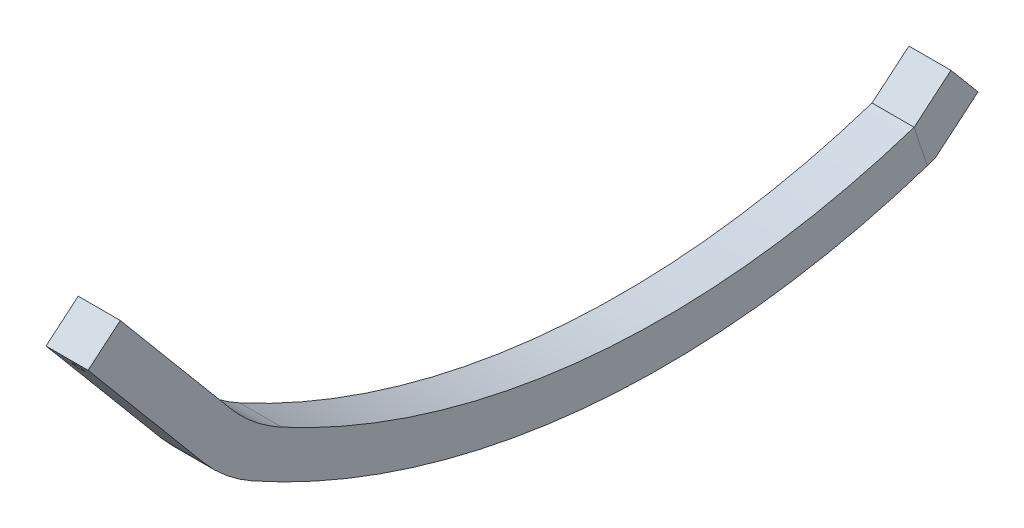
ISO-10303-21;
HEADER;
FILE_DESCRIPTION(('STEP AP214'),'2;1');
FILE_NAME('part.step','',(''),(''),'','','');
FILE_SCHEMA(('AUTOMOTIVE_DESIGN { 1 0 10303 214 1 1 1 1 }'));
ENDSEC;
DATA;
#1=APPLICATION_CONTEXT('core data for automotive mechanical design processes');
#2=APPLICATION_PROTOCOL_DEFINITION('international standard','automotive_design',2000,#1);
#3=PRODUCT_CONTEXT('',#1,'mechanical');
#4=PRODUCT('Part','Part','',(#3));
#5=PRODUCT_RELATED_PRODUCT_CATEGORY('part','',(#4));
#6=PRODUCT_DEFINITION_FORMATION('','',#4);
#7=PRODUCT_DEFINITION_CONTEXT('part definition',#1,'design');
#8=PRODUCT_DEFINITION('design','',#6,#7);
#9=PRODUCT_DEFINITION_SHAPE('','',#8);
#10=(LENGTH_UNIT() NAMED_UNIT(*) SI_UNIT(.MILLI.,.METRE.));
#11=(NAMED_UNIT(*) PLANE_ANGLE_UNIT() SI_UNIT($,.RADIAN.));
#12=(NAMED_UNIT(*) SI_UNIT($,.STERADIAN.) SOLID_ANGLE_UNIT());
#13=UNCERTAINTY_MEASURE_WITH_UNIT(LENGTH_MEASURE(1.E-05),#10,'distance_accuracy_value','');
#14=(GEOMETRIC_REPRESENTATION_CONTEXT(3) GLOBAL_UNCERTAINTY_ASSIGNED_CONTEXT((#13)) GLOBAL_UNIT_ASSIGNED_CONTEXT((#10,
#11,#12)) REPRESENTATION_CONTEXT('',''));
#15=CARTESIAN_POINT('',(0.,0.,0.));
#16=DIRECTION('',(0.,0.,1.));
#17=DIRECTION('',(1.,0.,0.));
#18=AXIS2_PLACEMENT_3D('',#15,#16,#17);
#19=CARTESIAN_POINT('',(12.,23.403668611832,3.73581881138778));
#20=DIRECTION('',(0.,0.311318234282315,-0.950305717652662));
#21=DIRECTION('',(0.,0.950305717652662,0.311318234282315));
#22=AXIS2_PLACEMENT_3D('',#19,#20,#21);
#23=PLANE('',#22);
#24=DIRECTION('',(0.,-0.950305717652662,-0.311318234282315));
#25=VECTOR('',#24,1.);
#26=CARTESIAN_POINT('',(0.,23.403668611832,3.73581881138778));
#27=LINE('',#26,#25);
#28=CARTESIAN_POINT('',(0.,23.403668611832,3.73581881138778));
#29=VERTEX_POINT('',#28);
#30=CARTESIAN_POINT('',(0.,12.,1.52655665885959E-13));
#31=VERTEX_POINT('',#30);
#32=EDGE_CURVE('E119',#29,#31,#27,.T.);
#33=ORIENTED_EDGE('',*,*,#32,.T.);
#34=DIRECTION('',(-1.,0.,0.));
#35=VECTOR('',#34,1.);
#36=CARTESIAN_POINT('',(12.,12.,1.52655665885959E-13));
#37=LINE('',#36,#35);
#38=CARTESIAN_POINT('',(12.,12.,1.52655665885959E-13));
#39=VERTEX_POINT('',#38);
#40=EDGE_CURVE('E12',#39,#31,#37,.T.);
#41=ORIENTED_EDGE('',*,*,#40,.F.);
#42=DIRECTION('',(0.,-0.950305717652662,-0.311318234282315));
#43=VECTOR('',#42,1.);
#44=CARTESIAN_POINT('',(12.,23.403668611832,3.73581881138778));
#45=LINE('',#44,#43);
#46=CARTESIAN_POINT('',(12.,23.403668611832,3.73581881138778));
#47=VERTEX_POINT('',#46);
#48=EDGE_CURVE('E127',#47,#39,#45,.T.);
#49=ORIENTED_EDGE('',*,*,#48,.F.);
#50=DIRECTION('',(-1.,0.,0.));
#51=VECTOR('',#50,1.);
#52=CARTESIAN_POINT('',(12.,23.403668611832,3.73581881138778));
#53=LINE('',#52,#51);
#54=EDGE_CURVE('E115',#47,#29,#53,.T.);
#55=ORIENTED_EDGE('',*,*,#54,.T.);
#56=EDGE_LOOP('',(#33,#41,#49,#55));
#57=FACE_BOUND('',#56,.T.);
#58=ADVANCED_FACE('F45',(#57),#23,.F.);
#59=CARTESIAN_POINT('',(12.,241.476472406345,75.1760290102655));
#60=DIRECTION('',(-1.,0.,0.));
#61=DIRECTION('',(0.,0.,1.));
#62=AXIS2_PLACEMENT_3D('',#59,#60,#61);
#63=CYLINDRICAL_SURFACE('',#62,241.476472406345);
#64=CARTESIAN_POINT('',(0.,241.476472406345,75.1760290102655));
#65=DIRECTION('',(1.,0.,0.));
#66=DIRECTION('',(0.,0.,-1.));
#67=AXIS2_PLACEMENT_3D('',#64,#65,#66);
#68=CIRCLE('',#67,241.476472406345);
#69=CARTESIAN_POINT('',(0.,12.7411493725965,-2.22577150147341));
#70=VERTEX_POINT('',#69);
#71=EDGE_CURVE('E122',#31,#70,#68,.T.);
#72=ORIENTED_EDGE('',*,*,#71,.T.);
#73=DIRECTION('',(-1.,0.,0.));
#74=VECTOR('',#73,1.);
#75=CARTESIAN_POINT('',(12.,12.7411493725965,-2.22577150147341));
#76=LINE('',#75,#74);
#77=CARTESIAN_POINT('',(12.,12.7411493725965,-2.22577150147341));
#78=VERTEX_POINT('',#77);
#79=EDGE_CURVE('E53',#78,#70,#76,.T.);
#80=ORIENTED_EDGE('',*,*,#79,.F.);
#81=CARTESIAN_POINT('',(12.,241.476472406345,75.1760290102655));
#82=DIRECTION('',(1.,0.,0.));
#83=DIRECTION('',(0.,0.,-1.));
#84=AXIS2_PLACEMENT_3D('',#81,#82,#83);
#85=CIRCLE('',#84,241.476472406345);
#86=EDGE_CURVE('E95',#39,#78,#85,.T.);
#87=ORIENTED_EDGE('',*,*,#86,.F.);
#88=ORIENTED_EDGE('',*,*,#40,.T.);
#89=EDGE_LOOP('',(#72,#80,#87,#88));
#90=FACE_BOUND('',#89,.T.);
#91=ADVANCED_FACE('F146',(#90),#63,.T.);
#92=CARTESIAN_POINT('',(12.,23.0257511275811,-14.4824825913771));
#93=DIRECTION('',(0.,0.766044443118982,0.642787609686534));
#94=DIRECTION('',(0.,-0.642787609686534,0.766044443118982));
#95=AXIS2_PLACEMENT_3D('',#92,#93,#94);
#96=PLANE('',#95);
#97=DIRECTION('',(0.,0.642787609686534,-0.766044443118982));
#98=VECTOR('',#97,1.);
#99=CARTESIAN_POINT('',(0.,23.0257511275811,-14.4824825913771));
#100=LINE('',#99,#98);
#101=CARTESIAN_POINT('',(0.,23.0257511275811,-14.4824825913771));
#102=VERTEX_POINT('',#101);
#103=EDGE_CURVE('E110',#70,#102,#100,.T.);
#104=ORIENTED_EDGE('',*,*,#103,.T.);
#105=DIRECTION('',(-1.,0.,0.));
#106=VECTOR('',#105,1.);
#107=CARTESIAN_POINT('',(12.,23.0257511275811,-14.4824825913771));
#108=LINE('',#107,#106);
#109=CARTESIAN_POINT('',(12.,23.0257511275811,-14.4824825913771));
#110=VERTEX_POINT('',#109);
#111=EDGE_CURVE('E107',#110,#102,#108,.T.);
#112=ORIENTED_EDGE('',*,*,#111,.F.);
#113=DIRECTION('',(0.,0.642787609686534,-0.766044443118982));
#114=VECTOR('',#113,1.);
#115=CARTESIAN_POINT('',(12.,23.0257511275811,-14.4824825913771));
#116=LINE('',#115,#114);
#117=EDGE_CURVE('E99',#78,#110,#116,.T.);
#118=ORIENTED_EDGE('',*,*,#117,.F.);
#119=ORIENTED_EDGE('',*,*,#79,.T.);
#120=EDGE_LOOP('',(#104,#112,#118,#119));
#121=FACE_BOUND('',#120,.T.);
#122=ADVANCED_FACE('F108',(#121),#96,.F.);
#123=CARTESIAN_POINT('',(12.,32.2182844450088,-6.7690312751387));
#124=DIRECTION('',(0.,-0.642787609686535,0.766044443118981));
#125=DIRECTION('',(0.,-0.766044443118981,-0.642787609686535));
#126=AXIS2_PLACEMENT_3D('',#123,#124,#125);
#127=PLANE('',#126);
#128=DIRECTION('',(0.,0.766044443118981,0.642787609686535));
#129=VECTOR('',#128,1.);
#130=CARTESIAN_POINT('',(0.,32.2182844450088,-6.7690312751387));
#131=LINE('',#130,#129);
#132=CARTESIAN_POINT('',(0.,32.2182844450088,-6.7690312751387));
#133=VERTEX_POINT('',#132);
#134=EDGE_CURVE('E81',#102,#133,#131,.T.);
#135=ORIENTED_EDGE('',*,*,#134,.T.);
#136=DIRECTION('',(-1.,0.,0.));
#137=VECTOR('',#136,1.);
#138=CARTESIAN_POINT('',(12.,32.2182844450088,-6.7690312751387));
#139=LINE('',#138,#137);
#140=CARTESIAN_POINT('',(12.,32.2182844450088,-6.7690312751387));
#141=VERTEX_POINT('',#140);
#142=EDGE_CURVE('E111',#141,#133,#139,.T.);
#143=ORIENTED_EDGE('',*,*,#142,.F.);
#144=DIRECTION('',(0.,0.766044443118981,0.642787609686535));
#145=VECTOR('',#144,1.);
#146=CARTESIAN_POINT('',(12.,32.2182844450088,-6.7690312751387));
#147=LINE('',#146,#145);
#148=EDGE_CURVE('E103',#110,#141,#147,.T.);
#149=ORIENTED_EDGE('',*,*,#148,.F.);
#150=ORIENTED_EDGE('',*,*,#111,.T.);
#151=EDGE_LOOP('',(#135,#143,#149,#150));
#152=FACE_BOUND('',#151,.T.);
#153=ADVANCED_FACE('F113',(#152),#127,.F.);
#154=CARTESIAN_POINT('',(12.,23.403668611832,3.73581881138778));
#155=DIRECTION('',(0.,-0.766044443118981,-0.642787609686535));
#156=DIRECTION('',(0.,0.642787609686535,-0.766044443118982));
#157=AXIS2_PLACEMENT_3D('',#154,#155,#156);
#158=PLANE('',#157);
#159=DIRECTION('',(0.,-0.642787609686535,0.766044443118982));
#160=VECTOR('',#159,1.);
#161=CARTESIAN_POINT('',(0.,23.403668611832,3.73581881138778));
#162=LINE('',#161,#160);
#163=EDGE_CURVE('E87',#133,#29,#162,.T.);
#164=ORIENTED_EDGE('',*,*,#163,.T.);
#165=ORIENTED_EDGE('',*,*,#54,.F.);
#166=DIRECTION('',(0.,-0.642787609686535,0.766044443118982));
#167=VECTOR('',#166,1.);
#168=CARTESIAN_POINT('',(12.,23.403668611832,3.73581881138778));
#169=LINE('',#168,#167);
#170=EDGE_CURVE('E61',#141,#47,#169,.T.);
#171=ORIENTED_EDGE('',*,*,#170,.F.);
#172=ORIENTED_EDGE('',*,*,#142,.T.);
#173=EDGE_LOOP('',(#164,#165,#171,#172));
#174=FACE_BOUND('',#173,.T.);
#175=ADVANCED_FACE('F135',(#174),#158,.F.);
#176=CARTESIAN_POINT('',(12.,241.476472406345,75.1760290102655));
#177=DIRECTION('',(1.,0.,0.));
#178=DIRECTION('',(0.,0.,-1.));
#179=AXIS2_PLACEMENT_3D('',#176,#177,#178);
#180=PLANE('',#179);
#181=ORIENTED_EDGE('',*,*,#48,.T.);
#182=ORIENTED_EDGE('',*,*,#86,.T.);
#183=ORIENTED_EDGE('',*,*,#117,.T.);
#184=ORIENTED_EDGE('',*,*,#148,.T.);
#185=ORIENTED_EDGE('',*,*,#170,.T.);
#186=EDGE_LOOP('',(#181,#182,#183,#184,#185));
#187=FACE_BOUND('',#186,.T.);
#188=ADVANCED_FACE('F101',(#187),#180,.T.);
#189=CARTESIAN_POINT('',(0.,241.476472406345,75.1760290102655));
#190=DIRECTION('',(1.,0.,0.));
#191=DIRECTION('',(0.,0.,-1.));
#192=AXIS2_PLACEMENT_3D('',#189,#190,#191);
#193=PLANE('',#192);
#194=ORIENTED_EDGE('',*,*,#32,.F.);
#195=ORIENTED_EDGE('',*,*,#163,.F.);
#196=ORIENTED_EDGE('',*,*,#134,.F.);
#197=ORIENTED_EDGE('',*,*,#103,.F.);
#198=ORIENTED_EDGE('',*,*,#71,.F.);
#199=EDGE_LOOP('',(#194,#195,#196,#197,#198));
#200=FACE_BOUND('',#199,.T.);
#201=ADVANCED_FACE('F131',(#200),#193,.F.);
#202=CLOSED_SHELL('',(#58,#91,#122,#153,#175,#188,#201));
#203=MANIFOLD_SOLID_BREP('B2',#202);
#204=CARTESIAN_POINT('',(12.,241.476472406345,75.1760290102655));
#205=DIRECTION('',(-1.,0.,0.));
#206=DIRECTION('',(0.,0.,1.));
#207=AXIS2_PLACEMENT_3D('',#204,#205,#206);
#208=CYLINDRICAL_SURFACE('',#207,241.476472406345);
#209=CARTESIAN_POINT('',(12.,241.476472406345,75.1760290102655));
#210=DIRECTION('',(1.,0.,0.));
#211=DIRECTION('',(0.,0.,1.));
#212=AXIS2_PLACEMENT_3D('',#209,#210,#211);
#213=CIRCLE('',#212,241.476472406345);
#214=CARTESIAN_POINT('',(12.,30.3736096091177,192.421361730282));
#215=VERTEX_POINT('',#214);
#216=CARTESIAN_POINT('',(12.,12.,0.));
#217=VERTEX_POINT('',#216);
#218=EDGE_CURVE('E290',#215,#217,#213,.T.);
#219=ORIENTED_EDGE('',*,*,#218,.F.);
#220=DIRECTION('',(-1.,0.,0.));
#221=VECTOR('',#220,1.);
#222=CARTESIAN_POINT('',(12.,30.3736096091177,192.421361730282));
#223=LINE('',#222,#221);
#224=CARTESIAN_POINT('',(0.,30.3736096091177,192.421361730282));
#225=VERTEX_POINT('',#224);
#226=EDGE_CURVE('E311',#215,#225,#223,.T.);
#227=ORIENTED_EDGE('',*,*,#226,.T.);
#228=CARTESIAN_POINT('',(0.,241.476472406345,75.1760290102655));
#229=DIRECTION('',(1.,0.,0.));
#230=DIRECTION('',(0.,0.,1.));
#231=AXIS2_PLACEMENT_3D('',#228,#229,#230);
#232=CIRCLE('',#231,241.476472406345);
#233=CARTESIAN_POINT('',(0.,12.,0.));
#234=VERTEX_POINT('',#233);
#235=EDGE_CURVE('E289',#225,#234,#232,.T.);
#236=ORIENTED_EDGE('',*,*,#235,.T.);
#237=DIRECTION('',(-1.,0.,0.));
#238=VECTOR('',#237,1.);
#239=CARTESIAN_POINT('',(12.,12.,0.));
#240=LINE('',#239,#238);
#241=EDGE_CURVE('E305',#217,#234,#240,.T.);
#242=ORIENTED_EDGE('',*,*,#241,.F.);
#243=EDGE_LOOP('',(#219,#227,#236,#242));
#244=FACE_BOUND('',#243,.T.);
#245=ADVANCED_FACE('F195',(#244),#208,.T.);
#246=CARTESIAN_POINT('',(12.,12.,0.));
#247=DIRECTION('',(0.,-0.311318234282315,0.950305717652662));
#248=DIRECTION('',(0.,-0.950305717652662,-0.311318234282315));
#249=AXIS2_PLACEMENT_3D('',#246,#247,#248);
#250=PLANE('',#249);
#251=DIRECTION('',(0.,0.950305717652662,0.311318234282315));
#252=VECTOR('',#251,1.);
#253=CARTESIAN_POINT('',(0.,12.,0.));
#254=LINE('',#253,#252);
#255=CARTESIAN_POINT('',(0.,23.403668611832,3.73581881138778));
#256=VERTEX_POINT('',#255);
#257=EDGE_CURVE('E299',#234,#256,#254,.T.);
#258=ORIENTED_EDGE('',*,*,#257,.T.);
#259=DIRECTION('',(-1.,0.,0.));
#260=VECTOR('',#259,1.);
#261=CARTESIAN_POINT('',(12.,23.403668611832,3.73581881138778));
#262=LINE('',#261,#260);
#263=CARTESIAN_POINT('',(12.,23.403668611832,3.73581881138778));
#264=VERTEX_POINT('',#263);
#265=EDGE_CURVE('E297',#264,#256,#262,.T.);
#266=ORIENTED_EDGE('',*,*,#265,.F.);
#267=DIRECTION('',(0.,0.950305717652662,0.311318234282315));
#268=VECTOR('',#267,1.);
#269=CARTESIAN_POINT('',(12.,12.,0.));
#270=LINE('',#269,#268);
#271=EDGE_CURVE('E292',#217,#264,#270,.T.);
#272=ORIENTED_EDGE('',*,*,#271,.F.);
#273=ORIENTED_EDGE('',*,*,#241,.T.);
#274=EDGE_LOOP('',(#258,#266,#272,#273));
#275=FACE_BOUND('',#274,.T.);
#276=ADVANCED_FACE('F337',(#275),#250,.F.);
#277=CARTESIAN_POINT('',(12.,241.476472406345,75.1760290102655));
#278=DIRECTION('',(-1.,0.,0.));
#279=DIRECTION('',(0.,0.,1.));
#280=AXIS2_PLACEMENT_3D('',#277,#278,#279);
#281=CYLINDRICAL_SURFACE('',#280,229.476472406345);
#282=CARTESIAN_POINT('',(0.,241.476472406345,75.1760290102655));
#283=DIRECTION('',(-1.,0.,0.));
#284=DIRECTION('',(0.,0.,1.));
#285=AXIS2_PLACEMENT_3D('',#282,#283,#284);
#286=CIRCLE('',#285,229.476472406345);
#287=CARTESIAN_POINT('',(0.,39.5231160556017,184.145259744128));
#288=VERTEX_POINT('',#287);
#289=EDGE_CURVE('E293',#256,#288,#286,.T.);
#290=ORIENTED_EDGE('',*,*,#289,.T.);
#291=DIRECTION('',(-1.,0.,0.));
#292=VECTOR('',#291,1.);
#293=CARTESIAN_POINT('',(12.,39.5231160556017,184.145259744128));
#294=LINE('',#293,#292);
#295=CARTESIAN_POINT('',(12.,39.5231160556017,184.145259744128));
#296=VERTEX_POINT('',#295);
#297=EDGE_CURVE('E320',#288,#296,#294,.F.);
#298=ORIENTED_EDGE('',*,*,#297,.T.);
#299=CARTESIAN_POINT('',(12.,241.476472406345,75.1760290102655));
#300=DIRECTION('',(-1.,0.,0.));
#301=DIRECTION('',(0.,0.,1.));
#302=AXIS2_PLACEMENT_3D('',#299,#300,#301);
#303=CIRCLE('',#302,229.476472406345);
#304=EDGE_CURVE('E295',#264,#296,#303,.T.);
#305=ORIENTED_EDGE('',*,*,#304,.F.);
#306=ORIENTED_EDGE('',*,*,#265,.T.);
#307=EDGE_LOOP('',(#290,#298,#305,#306));
#308=FACE_BOUND('',#307,.T.);
#309=ADVANCED_FACE('F331',(#308),#281,.F.);
#310=CARTESIAN_POINT('',(12.,241.476472406345,75.1760290102655));
#311=DIRECTION('',(-1.,0.,0.));
#312=DIRECTION('',(0.,0.,1.));
#313=AXIS2_PLACEMENT_3D('',#310,#311,#312);
#314=PLANE('',#313);
#315=DIRECTION('',(0.,0.766044443118982,0.642787609686535));
#316=VECTOR('',#315,1.);
#317=CARTESIAN_POINT('',(12.,71.9959787813234,231.662517153645));
#318=LINE('',#317,#316);
#319=CARTESIAN_POINT('',(12.,41.9450844088605,206.446822769164));
#320=VERTEX_POINT('',#319);
#321=CARTESIAN_POINT('',(12.,81.1885120987512,239.375968469883));
#322=VERTEX_POINT('',#321);
#323=EDGE_CURVE('E265',#320,#322,#318,.T.);
#324=ORIENTED_EDGE('',*,*,#323,.F.);
#325=CARTESIAN_POINT('',(12.,74.0844648931873,168.144600613215));
#326=DIRECTION('',(-1.,0.,0.));
#327=DIRECTION('',(0.,0.,1.));
#328=AXIS2_PLACEMENT_3D('',#325,#326,#327);
#329=CIRCLE('',#328,50.);
#330=EDGE_CURVE('E318',#320,#215,#329,.F.);
#331=ORIENTED_EDGE('',*,*,#330,.T.);
#332=ORIENTED_EDGE('',*,*,#218,.T.);
#333=ORIENTED_EDGE('',*,*,#271,.T.);
#334=ORIENTED_EDGE('',*,*,#304,.T.);
#335=CARTESIAN_POINT('',(12.,83.5261796884465,160.402252543611));
#336=DIRECTION('',(-1.,0.,0.));
#337=DIRECTION('',(0.,0.,1.));
#338=AXIS2_PLACEMENT_3D('',#335,#336,#337);
#339=CIRCLE('',#338,50.);
#340=CARTESIAN_POINT('',(12.,51.3867992041199,198.70447469956));
#341=VERTEX_POINT('',#340);
#342=EDGE_CURVE('E204',#296,#341,#339,.T.);
#343=ORIENTED_EDGE('',*,*,#342,.T.);
#344=DIRECTION('',(0.,0.766044443118982,0.642787609686534));
#345=VECTOR('',#344,1.);
#346=CARTESIAN_POINT('',(12.,79.7094300975618,222.469983836217));
#347=LINE('',#346,#345);
#348=CARTESIAN_POINT('',(12.,88.9019634149896,230.183435152455));
#349=VERTEX_POINT('',#348);
#350=EDGE_CURVE('E257',#341,#349,#347,.T.);
#351=ORIENTED_EDGE('',*,*,#350,.T.);
#352=DIRECTION('',(0.,0.642787609686532,-0.766044443118984));
#353=VECTOR('',#352,1.);
#354=CARTESIAN_POINT('',(12.,81.1885120987512,239.375968469883));
#355=LINE('',#354,#353);
#356=EDGE_CURVE('E262',#322,#349,#355,.T.);
#357=ORIENTED_EDGE('',*,*,#356,.F.);
#358=EDGE_LOOP('',(#324,#331,#332,#333,#334,#343,#351,#357));
#359=FACE_BOUND('',#358,.T.);
#360=ADVANCED_FACE('F260',(#359),#314,.F.);
#361=CARTESIAN_POINT('',(0.,241.476472406345,75.1760290102655));
#362=DIRECTION('',(-1.,0.,0.));
#363=DIRECTION('',(0.,0.,1.));
#364=AXIS2_PLACEMENT_3D('',#361,#362,#363);
#365=PLANE('',#364);
#366=ORIENTED_EDGE('',*,*,#235,.F.);
#367=CARTESIAN_POINT('',(0.,74.0844648931873,168.144600613215));
#368=DIRECTION('',(-1.,0.,0.));
#369=DIRECTION('',(0.,0.,1.));
#370=AXIS2_PLACEMENT_3D('',#367,#368,#369);
#371=CIRCLE('',#370,50.);
#372=CARTESIAN_POINT('',(0.,41.9450844088605,206.446822769164));
#373=VERTEX_POINT('',#372);
#374=EDGE_CURVE('E314',#225,#373,#371,.T.);
#375=ORIENTED_EDGE('',*,*,#374,.T.);
#376=DIRECTION('',(0.,-0.766044443118982,-0.642787609686535));
#377=VECTOR('',#376,1.);
#378=CARTESIAN_POINT('',(0.,94.3966616452473,250.458921882882));
#379=LINE('',#378,#377);
#380=CARTESIAN_POINT('',(0.,81.1885120987512,239.375968469883));
#381=VERTEX_POINT('',#380);
#382=EDGE_CURVE('E308',#381,#373,#379,.T.);
#383=ORIENTED_EDGE('',*,*,#382,.F.);
#384=DIRECTION('',(0.,-0.642787609686532,0.766044443118984));
#385=VECTOR('',#384,1.);
#386=CARTESIAN_POINT('',(0.,81.1885120987512,239.375968469883));
#387=LINE('',#386,#385);
#388=CARTESIAN_POINT('',(0.,88.9019634149896,230.183435152455));
#389=VERTEX_POINT('',#388);
#390=EDGE_CURVE('E274',#389,#381,#387,.T.);
#391=ORIENTED_EDGE('',*,*,#390,.F.);
#392=DIRECTION('',(0.,0.766044443118982,0.642787609686534));
#393=VECTOR('',#392,1.);
#394=CARTESIAN_POINT('',(0.,79.7094300975618,222.469983836217));
#395=LINE('',#394,#393);
#396=CARTESIAN_POINT('',(0.,51.3867992041198,198.70447469956));
#397=VERTEX_POINT('',#396);
#398=EDGE_CURVE('E264',#397,#389,#395,.T.);
#399=ORIENTED_EDGE('',*,*,#398,.F.);
#400=CARTESIAN_POINT('',(0.,83.5261796884465,160.402252543611));
#401=DIRECTION('',(-1.,0.,0.));
#402=DIRECTION('',(0.,0.,1.));
#403=AXIS2_PLACEMENT_3D('',#400,#401,#402);
#404=CIRCLE('',#403,50.);
#405=EDGE_CURVE('E43',#397,#288,#404,.F.);
#406=ORIENTED_EDGE('',*,*,#405,.T.);
#407=ORIENTED_EDGE('',*,*,#289,.F.);
#408=ORIENTED_EDGE('',*,*,#257,.F.);
#409=EDGE_LOOP('',(#366,#375,#383,#391,#399,#406,#407,#408));
#410=FACE_BOUND('',#409,.T.);
#411=ADVANCED_FACE('F327',(#410),#365,.T.);
#412=CARTESIAN_POINT('',(-52.3125128274926,79.7094300975618,222.469983836217));
#413=DIRECTION('',(0.,0.642787609686534,-0.766044443118982));
#414=DIRECTION('',(0.,0.766044443118982,0.642787609686534));
#415=AXIS2_PLACEMENT_3D('',#412,#413,#414);
#416=PLANE('',#415);
#417=CARTESIAN_POINT('',(6.,85.071741199395,226.969497104023));
#418=DIRECTION('',(0.,0.642787609686533,-0.766044443118984));
#419=DIRECTION('',(0.,0.766044443118984,0.642787609686533));
#420=AXIS2_PLACEMENT_3D('',#417,#418,#419);
#421=CIRCLE('',#420,1.54999999999999);
#422=CARTESIAN_POINT('',(6.,86.2591100862294,227.965817899037));
#423=VERTEX_POINT('',#422);
#424=EDGE_CURVE('E282',#423,#423,#421,.T.);
#425=ORIENTED_EDGE('',*,*,#424,.F.);
#426=EDGE_LOOP('',(#425));
#427=FACE_BOUND('',#426,.T.);
#428=ORIENTED_EDGE('',*,*,#350,.F.);
#429=DIRECTION('',(-1.,0.,0.));
#430=VECTOR('',#429,1.);
#431=CARTESIAN_POINT('',(-52.3125128274926,51.3867992041198,198.70447469956));
#432=LINE('',#431,#430);
#433=EDGE_CURVE('E322',#341,#397,#432,.T.);
#434=ORIENTED_EDGE('',*,*,#433,.T.);
#435=ORIENTED_EDGE('',*,*,#398,.T.);
#436=DIRECTION('',(-1.,0.,0.));
#437=VECTOR('',#436,1.);
#438=CARTESIAN_POINT('',(0.,88.9019634149896,230.183435152455));
#439=LINE('',#438,#437);
#440=EDGE_CURVE('E268',#349,#389,#439,.T.);
#441=ORIENTED_EDGE('',*,*,#440,.F.);
#442=EDGE_LOOP('',(#428,#434,#435,#441));
#443=FACE_BOUND('',#442,.T.);
#444=ADVANCED_FACE('F269',(#427,#443),#416,.T.);
#445=CARTESIAN_POINT('',(0.,71.9959787813234,231.662517153645));
#446=DIRECTION('',(0.,0.642787609686535,-0.766044443118982));
#447=DIRECTION('',(0.,0.766044443118982,0.642787609686535));
#448=AXIS2_PLACEMENT_3D('',#445,#446,#447);
#449=PLANE('',#448);
#450=CARTESIAN_POINT('',(6.,77.3582898831564,236.162030421451));
#451=DIRECTION('',(0.,0.642787609686535,-0.766044443118982));
#452=DIRECTION('',(0.,0.766044443118982,0.642787609686535));
#453=AXIS2_PLACEMENT_3D('',#450,#451,#452);
#454=CIRCLE('',#453,1.54999999999999);
#455=CARTESIAN_POINT('',(6.,78.5456587699908,237.158351216465));
#456=VERTEX_POINT('',#455);
#457=EDGE_CURVE('E199',#456,#456,#454,.T.);
#458=ORIENTED_EDGE('',*,*,#457,.T.);
#459=EDGE_LOOP('',(#458));
#460=FACE_BOUND('',#459,.T.);
#461=ORIENTED_EDGE('',*,*,#382,.T.);
#462=DIRECTION('',(-1.,0.,0.));
#463=VECTOR('',#462,1.);
#464=CARTESIAN_POINT('',(0.,41.9450844088605,206.446822769164));
#465=LINE('',#464,#463);
#466=EDGE_CURVE('E316',#373,#320,#465,.F.);
#467=ORIENTED_EDGE('',*,*,#466,.T.);
#468=ORIENTED_EDGE('',*,*,#323,.T.);
#469=DIRECTION('',(1.,0.,0.));
#470=VECTOR('',#469,1.);
#471=CARTESIAN_POINT('',(0.,81.1885120987512,239.375968469883));
#472=LINE('',#471,#470);
#473=EDGE_CURVE('E279',#381,#322,#472,.T.);
#474=ORIENTED_EDGE('',*,*,#473,.F.);
#475=EDGE_LOOP('',(#461,#467,#468,#474));
#476=FACE_BOUND('',#475,.T.);
#477=ADVANCED_FACE('F346',(#460,#476),#449,.F.);
#478=CARTESIAN_POINT('',(12.,74.0844648931873,168.144600613215));
#479=DIRECTION('',(-1.,0.,0.));
#480=DIRECTION('',(0.,0.,1.));
#481=AXIS2_PLACEMENT_3D('',#478,#479,#480);
#482=CYLINDRICAL_SURFACE('',#481,50.);
#483=ORIENTED_EDGE('',*,*,#330,.F.);
#484=ORIENTED_EDGE('',*,*,#466,.F.);
#485=ORIENTED_EDGE('',*,*,#374,.F.);
#486=ORIENTED_EDGE('',*,*,#226,.F.);
#487=EDGE_LOOP('',(#483,#484,#485,#486));
#488=FACE_BOUND('',#487,.T.);
#489=ADVANCED_FACE('F343',(#488),#482,.T.);
#490=CARTESIAN_POINT('',(12.,83.5261796884465,160.402252543611));
#491=DIRECTION('',(-1.,0.,0.));
#492=DIRECTION('',(0.,0.,1.));
#493=AXIS2_PLACEMENT_3D('',#490,#491,#492);
#494=CYLINDRICAL_SURFACE('',#493,50.);
#495=ORIENTED_EDGE('',*,*,#405,.F.);
#496=ORIENTED_EDGE('',*,*,#433,.F.);
#497=ORIENTED_EDGE('',*,*,#342,.F.);
#498=ORIENTED_EDGE('',*,*,#297,.F.);
#499=EDGE_LOOP('',(#495,#496,#497,#498));
#500=FACE_BOUND('',#499,.T.);
#501=ADVANCED_FACE('F197',(#500),#494,.F.);
#502=CARTESIAN_POINT('',(0.,165.513029453068,138.881921969101));
#503=DIRECTION('',(0.,-0.766044443118984,-0.642787609686532));
#504=DIRECTION('',(0.,0.642787609686532,-0.766044443118984));
#505=AXIS2_PLACEMENT_3D('',#502,#503,#504);
#506=PLANE('',#505);
#507=ORIENTED_EDGE('',*,*,#356,.T.);
#508=ORIENTED_EDGE('',*,*,#440,.T.);
#509=ORIENTED_EDGE('',*,*,#390,.T.);
#510=ORIENTED_EDGE('',*,*,#473,.T.);
#511=EDGE_LOOP('',(#507,#508,#509,#510));
#512=FACE_BOUND('',#511,.T.);
#513=ADVANCED_FACE('F277',(#512),#506,.F.);
#514=CARTESIAN_POINT('',(6.,43.8131524205003,276.139568506638));
#515=DIRECTION('',(0.,0.642787609686533,-0.766044443118983));
#516=DIRECTION('',(0.,0.766044443118983,0.642787609686533));
#517=AXIS2_PLACEMENT_3D('',#514,#515,#516);
#518=CYLINDRICAL_SURFACE('',#517,1.54999999999999);
#519=ORIENTED_EDGE('',*,*,#424,.T.);
#520=EDGE_LOOP('',(#519));
#521=FACE_BOUND('',#520,.T.);
#522=ORIENTED_EDGE('',*,*,#457,.F.);
#523=EDGE_LOOP('',(#522));
#524=FACE_BOUND('',#523,.T.);
#525=ADVANCED_FACE('F399',(#521,#524),#518,.F.);
#526=CLOSED_SHELL('',(#245,#276,#309,#360,#411,#444,#477,#489,#501,#513,#525));
#527=MANIFOLD_SOLID_BREP('B6',#526);
#528=ADVANCED_BREP_SHAPE_REPRESENTATION('',(#18,#203,#527),#14);
#529=SHAPE_DEFINITION_REPRESENTATION(#9,#528);
ENDSEC;
END-ISO-10303-21;
